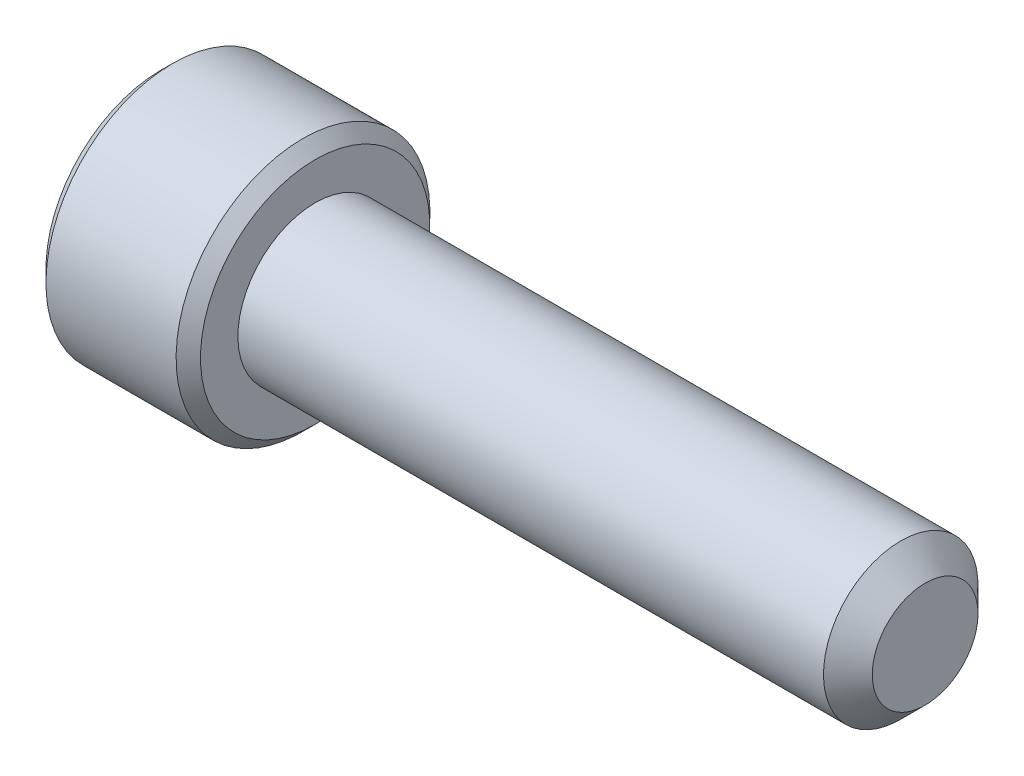
ISO-10303-21;
HEADER;
FILE_DESCRIPTION(('STEP AP214'),'2;1');
FILE_NAME('part.step','',(''),(''),'','','');
FILE_SCHEMA(('AUTOMOTIVE_DESIGN { 1 0 10303 214 1 1 1 1 }'));
ENDSEC;
DATA;
#1=APPLICATION_CONTEXT('core data for automotive mechanical design processes');
#2=APPLICATION_PROTOCOL_DEFINITION('international standard','automotive_design',2000,#1);
#3=PRODUCT_CONTEXT('',#1,'mechanical');
#4=PRODUCT('Part','Part','',(#3));
#5=PRODUCT_RELATED_PRODUCT_CATEGORY('part','',(#4));
#6=PRODUCT_DEFINITION_FORMATION('','',#4);
#7=PRODUCT_DEFINITION_CONTEXT('part definition',#1,'design');
#8=PRODUCT_DEFINITION('design','',#6,#7);
#9=PRODUCT_DEFINITION_SHAPE('','',#8);
#10=(LENGTH_UNIT() NAMED_UNIT(*) SI_UNIT(.MILLI.,.METRE.));
#11=(NAMED_UNIT(*) PLANE_ANGLE_UNIT() SI_UNIT($,.RADIAN.));
#12=(NAMED_UNIT(*) SI_UNIT($,.STERADIAN.) SOLID_ANGLE_UNIT());
#13=UNCERTAINTY_MEASURE_WITH_UNIT(LENGTH_MEASURE(1.E-05),#10,'distance_accuracy_value','');
#14=(GEOMETRIC_REPRESENTATION_CONTEXT(3) GLOBAL_UNCERTAINTY_ASSIGNED_CONTEXT((#13)) GLOBAL_UNIT_ASSIGNED_CONTEXT((#10,
#11,#12)) REPRESENTATION_CONTEXT('',''));
#15=CARTESIAN_POINT('',(0.,0.,0.));
#16=DIRECTION('',(0.,0.,1.));
#17=DIRECTION('',(1.,0.,0.));
#18=AXIS2_PLACEMENT_3D('',#15,#16,#17);
#19=CARTESIAN_POINT('',(-4.826,0.,0.));
#20=DIRECTION('',(-1.,0.,0.));
#21=DIRECTION('',(0.,-1.,0.));
#22=AXIS2_PLACEMENT_3D('',#19,#20,#21);
#23=CONICAL_SURFACE('',#22,2.29135888084633,0.785398163397443);
#24=CARTESIAN_POINT('',(-4.82611547878184,1.14556397036933,1.984575));
#25=CARTESIAN_POINT('',(-4.78676285226391,1.18494849354192,1.9163590048332));
#26=CARTESIAN_POINT('',(-4.74972131044618,1.22499159714897,1.84700231489304));
#27=CARTESIAN_POINT('',(-4.68189885842332,1.30664400291398,1.70557619954782));
#28=CARTESIAN_POINT('',(-4.65115568909175,1.34826107209555,1.63349332126322));
#29=CARTESIAN_POINT('',(-4.59849188881121,1.43217992591557,1.488141602734));
#30=CARTESIAN_POINT('',(-4.57643887587996,1.47446033414662,1.41490978751307));
#31=CARTESIAN_POINT('',(-4.54246149294387,1.55995203534886,1.2668338174053));
#32=CARTESIAN_POINT('',(-4.53051175609172,1.60316071596704,1.19199418724659));
#33=CARTESIAN_POINT('',(-4.5197300990819,1.6776271237807,1.0630145854562));
#34=CARTESIAN_POINT('',(-4.51813389905907,1.70878862377409,1.00904128422757));
#35=CARTESIAN_POINT('',(-4.52082183886529,1.77106070163464,0.901182881480215));
#36=CARTESIAN_POINT('',(-4.52510804034045,1.80217125782055,0.847297817514493));
#37=CARTESIAN_POINT('',(-4.53931687301351,1.86409863044401,0.740036461751415));
#38=CARTESIAN_POINT('',(-4.54924581045226,1.89491507894442,0.686660807239879));
#39=CARTESIAN_POINT('',(-4.57419508427453,1.95601509066826,0.580832482591125));
#40=CARTESIAN_POINT('',(-4.58921503038948,1.98629869455159,0.52837974202892));
#41=CARTESIAN_POINT('',(-4.63380785163566,2.06387267818151,0.39401766103637));
#42=CARTESIAN_POINT('',(-4.66674299593832,2.11068193911104,0.312941642841691));
#43=CARTESIAN_POINT('',(-4.72234244120219,2.17951072233758,0.19372669327017));
#44=CARTESIAN_POINT('',(-4.74187759205186,2.20219286161692,0.154440075614006));
#45=CARTESIAN_POINT('',(-4.7827287381194,2.24713694590237,0.0765946381319512));
#46=CARTESIAN_POINT('',(-4.80404363956835,2.26939913882716,0.0380353888983038));
#47=CARTESIAN_POINT('',(-4.82611547878184,2.29147435090017,-0.000199999999999197));
#48=B_SPLINE_CURVE_WITH_KNOTS('',3,(#24,#25,#26,#27,#28,#29,#30,#31,#32,#33,#34,#35,#36,#37,#38,
#39,#40,#41,#42,#43,#44,#45,#46,#47),.UNSPECIFIED.,.F.,.F.,(4,2,2,2,2,2,2,2,2,2,2,4),(0.,
0.264339630306623,0.530219665093688,0.791876416371451,1.05287424418108,1.23963984393199,
1.4264709174385,1.61351120244032,1.80053715247538,2.09764209964315,2.24579179873713,
2.39385111134157),.UNSPECIFIED.);
#49=CARTESIAN_POINT('',(-4.826,1.14567944042317,1.984375));
#50=VERTEX_POINT('',#49);
#51=CARTESIAN_POINT('',(-4.826,2.29135888084633,0.));
#52=VERTEX_POINT('',#51);
#53=EDGE_CURVE('E91',#50,#52,#48,.T.);
#54=ORIENTED_EDGE('',*,*,#53,.F.);
#55=CARTESIAN_POINT('',(-4.826,0.,0.));
#56=DIRECTION('',(1.,0.,0.));
#57=DIRECTION('',(0.,1.,0.));
#58=AXIS2_PLACEMENT_3D('',#55,#56,#57);
#59=CIRCLE('',#58,2.29135888084633);
#60=EDGE_CURVE('E190',#52,#50,#59,.T.);
#61=ORIENTED_EDGE('',*,*,#60,.F.);
#62=EDGE_LOOP('',(#54,#61));
#63=FACE_BOUND('',#62,.T.);
#64=ADVANCED_FACE('F32',(#63),#23,.F.);
#65=CARTESIAN_POINT('',(-7.34552503164278,-4.38256316312969,1.984375));
#66=CARTESIAN_POINT('',(-7.22855454754807,-4.25412150672958,1.984375));
#67=CARTESIAN_POINT('',(-7.1120218967379,-4.12527465006827,1.984375));
#68=CARTESIAN_POINT('',(-6.88017233530987,-3.86643242495077,1.984375));
#69=CARTESIAN_POINT('',(-6.76485574835251,-3.73643676685388,1.984375));
#70=CARTESIAN_POINT('',(-6.53496761730952,-3.47402997746118,1.984375));
#71=CARTESIAN_POINT('',(-6.42040843251579,-3.34160799076587,1.984375));
#72=CARTESIAN_POINT('',(-6.19354881314577,-3.07486646254648,1.984375));
#73=CARTESIAN_POINT('',(-6.08124807001603,-2.94054718456238,1.984375));
#74=CARTESIAN_POINT('',(-5.87562128395703,-2.68866291476753,1.984375));
#75=CARTESIAN_POINT('',(-5.78187450848826,-2.57144250733694,1.984375));
#76=CARTESIAN_POINT('',(-5.59763661164621,-2.33447351144926,1.984375));
#77=CARTESIAN_POINT('',(-5.50714512492787,-2.21472520910972,1.984375));
#78=CARTESIAN_POINT('',(-5.33096679527763,-1.97197030416461,1.984375));
#79=CARTESIAN_POINT('',(-5.24527361385108,-1.84896833197487,1.984375));
#80=CARTESIAN_POINT('',(-5.08091907299013,-1.5983684417922,1.984375));
#81=CARTESIAN_POINT('',(-5.00225291006126,-1.47077374828022,1.984375));
#82=CARTESIAN_POINT('',(-4.89371881405518,-1.27679924803707,1.984375));
#83=CARTESIAN_POINT('',(-4.85961697469403,-1.21280681023282,1.984375));
#84=CARTESIAN_POINT('',(-4.79470022081286,-1.08318295509689,1.984375));
#85=CARTESIAN_POINT('',(-4.76388592959238,-1.01755122986674,1.984375));
#86=CARTESIAN_POINT('',(-4.67770673157076,-0.818112319573823,1.984375));
#87=CARTESIAN_POINT('',(-4.62841532737901,-0.68143817164542,1.984375));
#88=CARTESIAN_POINT('',(-4.57657464506238,-0.484534849228625,1.984375));
#89=CARTESIAN_POINT('',(-4.56363539685181,-0.426997354657412,1.984375));
#90=CARTESIAN_POINT('',(-4.54244355417043,-0.311075231587787,1.984375));
#91=CARTESIAN_POINT('',(-4.53418863196629,-0.252691038648901,1.984375));
#92=CARTESIAN_POINT('',(-4.52278589268839,-0.13552699683614,1.984375));
#93=CARTESIAN_POINT('',(-4.51962887606188,-0.0767480533087008,1.984375));
#94=CARTESIAN_POINT('',(-4.51856562625872,0.040859379256393,1.984375));
#95=CARTESIAN_POINT('',(-4.52065945666977,0.0996878688854256,1.984375));
#96=CARTESIAN_POINT('',(-4.52997042541556,0.216780947001194,1.984375));
#97=CARTESIAN_POINT('',(-4.53717454062507,0.27504658807381,1.984375));
#98=CARTESIAN_POINT('',(-4.55632471278146,0.390795753314785,1.984375));
#99=CARTESIAN_POINT('',(-4.56827186597105,0.448279093493553,1.984375));
#100=CARTESIAN_POINT('',(-4.59641432696866,0.562343003284734,1.984375));
#101=CARTESIAN_POINT('',(-4.61262065429991,0.618920821282784,1.984375));
#102=CARTESIAN_POINT('',(-4.6486728879034,0.730887391144706,1.984375));
#103=CARTESIAN_POINT('',(-4.6685186047409,0.786276204730186,1.984375));
#104=CARTESIAN_POINT('',(-4.71904823616544,0.915764898686524,1.984375));
#105=CARTESIAN_POINT('',(-4.75104975645409,0.989348684601598,1.984375));
#106=CARTESIAN_POINT('',(-4.8195013348601,1.13443207793684,1.984375));
#107=CARTESIAN_POINT('',(-4.85595375222347,1.20593055492455,1.984375));
#108=CARTESIAN_POINT('',(-4.93238072627356,1.34720036694736,1.984375));
#109=CARTESIAN_POINT('',(-4.97236254348688,1.41696774475327,1.984375));
#110=CARTESIAN_POINT('',(-5.05501798725671,1.55486033218906,1.984375));
#111=CARTESIAN_POINT('',(-5.09769114108908,1.62298582732066,1.984375));
#112=CARTESIAN_POINT('',(-5.22979965333655,1.82673884970796,1.984375));
#113=CARTESIAN_POINT('',(-5.3224862074514,1.96025358861665,1.984375));
#114=CARTESIAN_POINT('',(-5.51320461076306,2.22310529105792,1.984375));
#115=CARTESIAN_POINT('',(-5.61123029191713,2.35244681162555,1.984375));
#116=CARTESIAN_POINT('',(-5.8417818135648,2.64771927567201,1.984375));
#117=CARTESIAN_POINT('',(-5.97561838149977,2.81262293237342,1.984375));
#118=CARTESIAN_POINT('',(-6.24732511473647,3.13917450761943,1.984375));
#119=CARTESIAN_POINT('',(-6.38519718943843,3.30082082182293,1.984375));
#120=CARTESIAN_POINT('',(-6.65925694098781,3.61672188433627,1.984375));
#121=CARTESIAN_POINT('',(-6.79536117949515,3.77104919551812,1.984375));
#122=CARTESIAN_POINT('',(-7.00081696190316,4.00127089894086,1.984375));
#123=CARTESIAN_POINT('',(-7.06949247318902,4.07777111865017,1.984375));
#124=CARTESIAN_POINT('',(-7.20723205118175,4.23041862936248,1.984375));
#125=CARTESIAN_POINT('',(-7.27629611110184,4.30656592648787,1.984375));
#126=CARTESIAN_POINT('',(-7.34552503164278,4.38256316312969,1.984375));
#127=B_SPLINE_CURVE_WITH_KNOTS('',3,(#65,#66,#67,#68,#69,#70,#71,#72,#73,#74,#75,#76,#77,#78,
#79,#80,#81,#82,#83,#84,#85,#86,#87,#88,#89,#90,#91,#92,#93,#94,#95,#96,#97,#98,#99,#100,#101,
#102,#103,#104,#105,#106,#107,#108,#109,#110,#111,#112,#113,#114,#115,#116,#117,#118,#119,#120,
#121,#122,#123,#124,#125,#126),.UNSPECIFIED.,.F.,.F.,(4,2,2,2,2,2,2,2,2,2,2,2,2,2,2,2,2,2,2,2,2,
2,2,2,2,2,2,2,2,2,4),(0.,0.5211724127341,1.04248020388798,1.56775750090225,2.09296253899618,
2.5432150115554,2.993416793061,3.44300910932738,3.89229170529407,4.10973556952338,
4.32722058682471,4.76107034419634,4.93783869037214,5.11451911980139,5.29088035839971,
5.46724373274119,5.64315926728084,5.81911548429021,5.99553150295932,6.17193834156116,
6.41246021585711,6.65311013938415,6.89426719857916,7.13538201669343,7.62272742387335,
8.10952129660061,8.74655188785267,9.38388892417281,10.0011777857046,10.3095881172925,
10.6179930785071),.UNSPECIFIED.);
#128=CARTESIAN_POINT('',(-4.826,-1.14567944042317,1.984375));
#129=VERTEX_POINT('',#128);
#130=EDGE_CURVE('E167',#129,#50,#127,.T.);
#131=ORIENTED_EDGE('',*,*,#130,.F.);
#132=EDGE_CURVE('E193',#50,#129,#59,.T.);
#133=ORIENTED_EDGE('',*,*,#132,.F.);
#134=EDGE_LOOP('',(#131,#133));
#135=FACE_BOUND('',#134,.T.);
#136=ADVANCED_FACE('F209',(#135),#23,.F.);
#137=CARTESIAN_POINT('',(-4.82611547878184,-2.29147435090017,-0.000199999999999607));
#138=CARTESIAN_POINT('',(-4.78676285226391,-2.25208982772758,0.0680159951668021));
#139=CARTESIAN_POINT('',(-4.74972131044618,-2.21204672412052,0.137372685106965));
#140=CARTESIAN_POINT('',(-4.68189885842332,-2.13039431835552,0.278798800452185));
#141=CARTESIAN_POINT('',(-4.65115568909175,-2.08877724917394,0.350881678736779));
#142=CARTESIAN_POINT('',(-4.59849188881121,-2.00485839535392,0.496233397265999));
#143=CARTESIAN_POINT('',(-4.57643887587996,-1.96257798712287,0.569465212486933));
#144=CARTESIAN_POINT('',(-4.54246149294387,-1.87708628592064,0.717541182594699));
#145=CARTESIAN_POINT('',(-4.53051175609172,-1.83387760530245,0.792380812753416));
#146=CARTESIAN_POINT('',(-4.5197300990819,-1.7594111974888,0.921360414543805));
#147=CARTESIAN_POINT('',(-4.51813389905906,-1.7282496974954,0.975333715772431));
#148=CARTESIAN_POINT('',(-4.52082183886529,-1.66597761963485,1.08319211851979));
#149=CARTESIAN_POINT('',(-4.52510804034045,-1.63486706344894,1.13707718248551));
#150=CARTESIAN_POINT('',(-4.53931687301351,-1.57293969082548,1.24433853824859));
#151=CARTESIAN_POINT('',(-4.54924581045226,-1.54212324232508,1.29771419276012));
#152=CARTESIAN_POINT('',(-4.57419508427453,-1.48102323060123,1.40354251740888));
#153=CARTESIAN_POINT('',(-4.58921503038948,-1.45073962671791,1.45599525797108));
#154=CARTESIAN_POINT('',(-4.63380785163566,-1.37316564308798,1.59035733896363));
#155=CARTESIAN_POINT('',(-4.66674299593832,-1.32635638215846,1.67143335715831));
#156=CARTESIAN_POINT('',(-4.72234244120219,-1.25752759893192,1.79064830672983));
#157=CARTESIAN_POINT('',(-4.74187759205186,-1.23484545965258,1.829934924386));
#158=CARTESIAN_POINT('',(-4.7827287381194,-1.18990137536713,1.90778036186805));
#159=CARTESIAN_POINT('',(-4.80404363956835,-1.16763918244233,1.9463396111017));
#160=CARTESIAN_POINT('',(-4.82611547878184,-1.14556397036933,1.984575));
#161=B_SPLINE_CURVE_WITH_KNOTS('',3,(#137,#138,#139,#140,#141,#142,#143,#144,#145,#146,#147,
#148,#149,#150,#151,#152,#153,#154,#155,#156,#157,#158,#159,#160),.UNSPECIFIED.,.F.,.F.,(4,2,2,
2,2,2,2,2,2,2,2,4),(0.,0.264339630306624,0.530219665093689,0.791876416371453,1.05287424418108,
1.23963984393199,1.42647091743851,1.61351120244033,1.80053715247538,2.09764209964315,
2.24579179873713,2.39385111134157),.UNSPECIFIED.);
#162=CARTESIAN_POINT('',(-4.826,-2.29135888084633,0.));
#163=VERTEX_POINT('',#162);
#164=EDGE_CURVE('E259',#163,#129,#161,.T.);
#165=ORIENTED_EDGE('',*,*,#164,.F.);
#166=EDGE_CURVE('E253',#129,#163,#59,.T.);
#167=ORIENTED_EDGE('',*,*,#166,.F.);
#168=EDGE_LOOP('',(#165,#167));
#169=FACE_BOUND('',#168,.T.);
#170=ADVANCED_FACE('F214',(#169),#23,.F.);
#171=CARTESIAN_POINT('',(-4.82611547878184,-1.14556397036933,-1.984575));
#172=CARTESIAN_POINT('',(-4.78676285226391,-1.18494849354192,-1.9163590048332));
#173=CARTESIAN_POINT('',(-4.74972131044618,-1.22499159714897,-1.84700231489304));
#174=CARTESIAN_POINT('',(-4.68189885842332,-1.30664400291398,-1.70557619954782));
#175=CARTESIAN_POINT('',(-4.65115568909175,-1.34826107209555,-1.63349332126322));
#176=CARTESIAN_POINT('',(-4.59849188881121,-1.43217992591557,-1.488141602734));
#177=CARTESIAN_POINT('',(-4.57643887587996,-1.47446033414662,-1.41490978751307));
#178=CARTESIAN_POINT('',(-4.54246149294387,-1.55995203534886,-1.2668338174053));
#179=CARTESIAN_POINT('',(-4.53051175609172,-1.60316071596704,-1.19199418724659));
#180=CARTESIAN_POINT('',(-4.5197300990819,-1.6776271237807,-1.0630145854562));
#181=CARTESIAN_POINT('',(-4.51813389905906,-1.7087886237741,-1.00904128422757));
#182=CARTESIAN_POINT('',(-4.52082183886528,-1.77106070163464,-0.901182881480215));
#183=CARTESIAN_POINT('',(-4.52510804034045,-1.80217125782055,-0.847297817514493));
#184=CARTESIAN_POINT('',(-4.53931687301351,-1.86409863044401,-0.740036461751414));
#185=CARTESIAN_POINT('',(-4.54924581045226,-1.89491507894442,-0.686660807239878));
#186=CARTESIAN_POINT('',(-4.57419508427453,-1.95601509066827,-0.580832482591124));
#187=CARTESIAN_POINT('',(-4.58921503038948,-1.98629869455159,-0.528379742028919));
#188=CARTESIAN_POINT('',(-4.63380785163566,-2.06387267818151,-0.394017661036369));
#189=CARTESIAN_POINT('',(-4.66674299593832,-2.11068193911104,-0.31294164284169));
#190=CARTESIAN_POINT('',(-4.72234244120219,-2.17951072233758,-0.193726693270169));
#191=CARTESIAN_POINT('',(-4.74187759205186,-2.20219286161692,-0.154440075614005));
#192=CARTESIAN_POINT('',(-4.7827287381194,-2.24713694590237,-0.0765946381319501));
#193=CARTESIAN_POINT('',(-4.80404363956835,-2.26939913882716,-0.0380353888983025));
#194=CARTESIAN_POINT('',(-4.82611547878184,-2.29147435090017,0.00020000000000062));
#195=B_SPLINE_CURVE_WITH_KNOTS('',3,(#171,#172,#173,#174,#175,#176,#177,#178,#179,#180,#181,
#182,#183,#184,#185,#186,#187,#188,#189,#190,#191,#192,#193,#194),.UNSPECIFIED.,.F.,.F.,(4,2,2,
2,2,2,2,2,2,2,2,4),(0.,0.264339630306624,0.530219665093689,0.791876416371453,1.05287424418108,
1.23963984393199,1.42647091743851,1.61351120244033,1.80053715247538,2.09764209964315,
2.24579179873713,2.39385111134158),.UNSPECIFIED.);
#196=CARTESIAN_POINT('',(-4.826,-1.14567944042317,-1.984375));
#197=VERTEX_POINT('',#196);
#198=EDGE_CURVE('E246',#197,#163,#195,.T.);
#199=ORIENTED_EDGE('',*,*,#198,.F.);
#200=EDGE_CURVE('E252',#163,#197,#59,.T.);
#201=ORIENTED_EDGE('',*,*,#200,.F.);
#202=EDGE_LOOP('',(#199,#201));
#203=FACE_BOUND('',#202,.T.);
#204=ADVANCED_FACE('F233',(#203),#23,.F.);
#205=CARTESIAN_POINT('',(-7.34552503164278,4.38256316312969,-1.984375));
#206=CARTESIAN_POINT('',(-7.22855454754806,4.25412150672957,-1.984375));
#207=CARTESIAN_POINT('',(-7.11202189673789,4.12527465006826,-1.984375));
#208=CARTESIAN_POINT('',(-6.88017233530987,3.86643242495076,-1.984375));
#209=CARTESIAN_POINT('',(-6.76485574835251,3.73643676685388,-1.984375));
#210=CARTESIAN_POINT('',(-6.53496761730952,3.47402997746118,-1.984375));
#211=CARTESIAN_POINT('',(-6.42040843251579,3.34160799076586,-1.984375));
#212=CARTESIAN_POINT('',(-6.19354881314577,3.07486646254648,-1.984375));
#213=CARTESIAN_POINT('',(-6.08124807001603,2.94054718456238,-1.984375));
#214=CARTESIAN_POINT('',(-5.87562128395703,2.68866291476753,-1.984375));
#215=CARTESIAN_POINT('',(-5.78187450848826,2.57144250733694,-1.984375));
#216=CARTESIAN_POINT('',(-5.59763661164622,2.33447351144926,-1.984375));
#217=CARTESIAN_POINT('',(-5.50714512492787,2.21472520910972,-1.984375));
#218=CARTESIAN_POINT('',(-5.33096679527763,1.97197030416461,-1.984375));
#219=CARTESIAN_POINT('',(-5.24527361385108,1.84896833197487,-1.984375));
#220=CARTESIAN_POINT('',(-5.08091907299013,1.5983684417922,-1.984375));
#221=CARTESIAN_POINT('',(-5.00225291006126,1.47077374828022,-1.984375));
#222=CARTESIAN_POINT('',(-4.89371881405518,1.27679924803707,-1.984375));
#223=CARTESIAN_POINT('',(-4.85961697469403,1.21280681023282,-1.984375));
#224=CARTESIAN_POINT('',(-4.79470022081287,1.08318295509689,-1.984375));
#225=CARTESIAN_POINT('',(-4.76388592959239,1.01755122986674,-1.984375));
#226=CARTESIAN_POINT('',(-4.67770673157076,0.818112319573823,-1.984375));
#227=CARTESIAN_POINT('',(-4.62841532737901,0.68143817164542,-1.984375));
#228=CARTESIAN_POINT('',(-4.57657464506239,0.484534849228624,-1.984375));
#229=CARTESIAN_POINT('',(-4.56363539685182,0.426997354657412,-1.984375));
#230=CARTESIAN_POINT('',(-4.54244355417043,0.311075231587786,-1.984375));
#231=CARTESIAN_POINT('',(-4.53418863196629,0.252691038648901,-1.984375));
#232=CARTESIAN_POINT('',(-4.52278589268839,0.135526996836139,-1.984375));
#233=CARTESIAN_POINT('',(-4.51962887606188,0.0767480533086995,-1.984375));
#234=CARTESIAN_POINT('',(-4.51856562625872,-0.0408593792563943,-1.984375));
#235=CARTESIAN_POINT('',(-4.52065945666977,-0.0996878688854267,-1.984375));
#236=CARTESIAN_POINT('',(-4.52997042541556,-0.216780947001195,-1.984375));
#237=CARTESIAN_POINT('',(-4.53717454062507,-0.275046588073811,-1.984375));
#238=CARTESIAN_POINT('',(-4.55632471278146,-0.390795753314786,-1.984375));
#239=CARTESIAN_POINT('',(-4.56827186597105,-0.448279093493554,-1.984375));
#240=CARTESIAN_POINT('',(-4.59641432696866,-0.562343003284735,-1.984375));
#241=CARTESIAN_POINT('',(-4.61262065429991,-0.618920821282785,-1.984375));
#242=CARTESIAN_POINT('',(-4.6486728879034,-0.730887391144708,-1.984375));
#243=CARTESIAN_POINT('',(-4.6685186047409,-0.786276204730187,-1.984375));
#244=CARTESIAN_POINT('',(-4.71904823616544,-0.915764898686525,-1.984375));
#245=CARTESIAN_POINT('',(-4.75104975645409,-0.9893486846016,-1.984375));
#246=CARTESIAN_POINT('',(-4.8195013348601,-1.13443207793684,-1.984375));
#247=CARTESIAN_POINT('',(-4.85595375222347,-1.20593055492455,-1.984375));
#248=CARTESIAN_POINT('',(-4.93238072627356,-1.34720036694737,-1.984375));
#249=CARTESIAN_POINT('',(-4.97236254348688,-1.41696774475327,-1.984375));
#250=CARTESIAN_POINT('',(-5.05501798725671,-1.55486033218906,-1.984375));
#251=CARTESIAN_POINT('',(-5.09769114108908,-1.62298582732067,-1.984375));
#252=CARTESIAN_POINT('',(-5.22979965333655,-1.82673884970796,-1.984375));
#253=CARTESIAN_POINT('',(-5.3224862074514,-1.96025358861666,-1.984375));
#254=CARTESIAN_POINT('',(-5.51320461076306,-2.22310529105793,-1.984375));
#255=CARTESIAN_POINT('',(-5.61123029191713,-2.35244681162555,-1.984375));
#256=CARTESIAN_POINT('',(-5.8417818135648,-2.64771927567202,-1.984375));
#257=CARTESIAN_POINT('',(-5.97561838149977,-2.81262293237343,-1.984375));
#258=CARTESIAN_POINT('',(-6.24732511473647,-3.13917450761944,-1.984375));
#259=CARTESIAN_POINT('',(-6.38519718943843,-3.30082082182293,-1.984375));
#260=CARTESIAN_POINT('',(-6.65925694098781,-3.61672188433627,-1.984375));
#261=CARTESIAN_POINT('',(-6.79536117949515,-3.77104919551812,-1.984375));
#262=CARTESIAN_POINT('',(-7.00081696190315,-4.00127089894086,-1.984375));
#263=CARTESIAN_POINT('',(-7.06949247318902,-4.07777111865017,-1.984375));
#264=CARTESIAN_POINT('',(-7.20723205118175,-4.23041862936248,-1.984375));
#265=CARTESIAN_POINT('',(-7.27629611110184,-4.30656592648786,-1.984375));
#266=CARTESIAN_POINT('',(-7.34552503164278,-4.38256316312969,-1.984375));
#267=B_SPLINE_CURVE_WITH_KNOTS('',3,(#205,#206,#207,#208,#209,#210,#211,#212,#213,#214,#215,
#216,#217,#218,#219,#220,#221,#222,#223,#224,#225,#226,#227,#228,#229,#230,#231,#232,#233,#234,
#235,#236,#237,#238,#239,#240,#241,#242,#243,#244,#245,#246,#247,#248,#249,#250,#251,#252,#253,
#254,#255,#256,#257,#258,#259,#260,#261,#262,#263,#264,#265,#266),.UNSPECIFIED.,.F.,.F.,(4,2,2,
2,2,2,2,2,2,2,2,2,2,2,2,2,2,2,2,2,2,2,2,2,2,2,2,2,2,2,4),(0.,0.5211724127341,1.04248020388798,
1.56775750090225,2.09296253899618,2.5432150115554,2.99341679306099,3.44300910932738,
3.89229170529407,4.10973556952338,4.32722058682471,4.76107034419633,4.93783869037214,
5.11451911980138,5.2908803583997,5.46724373274119,5.64315926728084,5.8191154842902,
5.99553150295931,6.17193834156116,6.4124602158571,6.65311013938415,6.89426719857916,
7.13538201669343,7.62272742387335,8.10952129660061,8.74655188785267,9.3838889241728,
10.0011777857046,10.3095881172925,10.6179930785071),.UNSPECIFIED.);
#268=CARTESIAN_POINT('',(-4.826,1.14567944042317,-1.984375));
#269=VERTEX_POINT('',#268);
#270=EDGE_CURVE('E137',#269,#197,#267,.T.);
#271=ORIENTED_EDGE('',*,*,#270,.F.);
#272=EDGE_CURVE('E243',#197,#269,#59,.T.);
#273=ORIENTED_EDGE('',*,*,#272,.F.);
#274=EDGE_LOOP('',(#271,#273));
#275=FACE_BOUND('',#274,.T.);
#276=ADVANCED_FACE('F206',(#275),#23,.F.);
#277=CARTESIAN_POINT('',(-2.53464111915364,0.,0.));
#278=DIRECTION('',(1.,0.,0.));
#279=DIRECTION('',(0.,1.,0.));
#280=AXIS2_PLACEMENT_3D('',#277,#278,#279);
#281=CYLINDRICAL_SURFACE('',#280,2.413);
#282=CARTESIAN_POINT('',(0.,0.,0.));
#283=DIRECTION('',(1.,0.,0.));
#284=DIRECTION('',(0.,1.,0.));
#285=AXIS2_PLACEMENT_3D('',#282,#283,#284);
#286=CIRCLE('',#285,2.413);
#287=CARTESIAN_POINT('',(0.,2.413,0.));
#288=VERTEX_POINT('',#287);
#289=EDGE_CURVE('E174',#288,#288,#286,.T.);
#290=ORIENTED_EDGE('',*,*,#289,.T.);
#291=EDGE_LOOP('',(#290));
#292=FACE_BOUND('',#291,.T.);
#293=CARTESIAN_POINT('',(18.288,0.,0.));
#294=DIRECTION('',(1.,0.,0.));
#295=DIRECTION('',(0.,1.,0.));
#296=AXIS2_PLACEMENT_3D('',#293,#294,#295);
#297=CIRCLE('',#296,2.413);
#298=CARTESIAN_POINT('',(18.288,2.413,0.));
#299=VERTEX_POINT('',#298);
#300=EDGE_CURVE('E11',#299,#299,#297,.T.);
#301=ORIENTED_EDGE('',*,*,#300,.F.);
#302=EDGE_LOOP('',(#301));
#303=FACE_BOUND('',#302,.T.);
#304=ADVANCED_FACE('F34',(#292,#303),#281,.T.);
#305=CARTESIAN_POINT('',(19.05,0.,0.));
#306=DIRECTION('',(-1.,0.,0.));
#307=DIRECTION('',(0.,-1.,0.));
#308=AXIS2_PLACEMENT_3D('',#305,#306,#307);
#309=CONICAL_SURFACE('',#308,1.651,0.78539816339745);
#310=ORIENTED_EDGE('',*,*,#300,.T.);
#311=EDGE_LOOP('',(#310));
#312=FACE_BOUND('',#311,.T.);
#313=CARTESIAN_POINT('',(19.05,0.,0.));
#314=DIRECTION('',(1.,0.,0.));
#315=DIRECTION('',(0.,1.,0.));
#316=AXIS2_PLACEMENT_3D('',#313,#314,#315);
#317=CIRCLE('',#316,1.651);
#318=CARTESIAN_POINT('',(19.05,1.651,0.));
#319=VERTEX_POINT('',#318);
#320=EDGE_CURVE('E41',#319,#319,#317,.T.);
#321=ORIENTED_EDGE('',*,*,#320,.F.);
#322=EDGE_LOOP('',(#321));
#323=FACE_BOUND('',#322,.T.);
#324=ADVANCED_FACE('F199',(#312,#323),#309,.T.);
#325=CARTESIAN_POINT('',(19.05,0.,0.));
#326=DIRECTION('',(1.,0.,0.));
#327=DIRECTION('',(0.,1.,0.));
#328=AXIS2_PLACEMENT_3D('',#325,#326,#327);
#329=PLANE('',#328);
#330=ORIENTED_EDGE('',*,*,#320,.T.);
#331=EDGE_LOOP('',(#330));
#332=FACE_BOUND('',#331,.T.);
#333=ADVANCED_FACE('F197',(#332),#329,.T.);
#334=CARTESIAN_POINT('',(-4.82611547878184,2.29147435090017,0.000200000000000617));
#335=CARTESIAN_POINT('',(-4.78676285226391,2.25208982772758,-0.0680159951668013));
#336=CARTESIAN_POINT('',(-4.74972131044618,2.21204672412052,-0.137372685106964));
#337=CARTESIAN_POINT('',(-4.68189885842332,2.13039431835552,-0.278798800452184));
#338=CARTESIAN_POINT('',(-4.65115568909175,2.08877724917394,-0.350881678736778));
#339=CARTESIAN_POINT('',(-4.59849188881121,2.00485839535392,-0.496233397265997));
#340=CARTESIAN_POINT('',(-4.57643887587996,1.96257798712287,-0.569465212486931));
#341=CARTESIAN_POINT('',(-4.54246149294387,1.87708628592064,-0.717541182594697));
#342=CARTESIAN_POINT('',(-4.53051175609172,1.83387760530245,-0.792380812753414));
#343=CARTESIAN_POINT('',(-4.5197300990819,1.7594111974888,-0.921360414543804));
#344=CARTESIAN_POINT('',(-4.51813389905907,1.7282496974954,-0.975333715772429));
#345=CARTESIAN_POINT('',(-4.52082183886529,1.66597761963485,-1.08319211851979));
#346=CARTESIAN_POINT('',(-4.52510804034045,1.63486706344894,-1.13707718248551));
#347=CARTESIAN_POINT('',(-4.53931687301351,1.57293969082548,-1.24433853824859));
#348=CARTESIAN_POINT('',(-4.54924581045226,1.54212324232508,-1.29771419276012));
#349=CARTESIAN_POINT('',(-4.57419508427453,1.48102323060123,-1.40354251740888));
#350=CARTESIAN_POINT('',(-4.58921503038948,1.45073962671791,-1.45599525797108));
#351=CARTESIAN_POINT('',(-4.63380785163566,1.37316564308798,-1.59035733896363));
#352=CARTESIAN_POINT('',(-4.66674299593832,1.32635638215846,-1.67143335715831));
#353=CARTESIAN_POINT('',(-4.72234244120219,1.25752759893191,-1.79064830672983));
#354=CARTESIAN_POINT('',(-4.74187759205186,1.23484545965258,-1.829934924386));
#355=CARTESIAN_POINT('',(-4.7827287381194,1.18990137536713,-1.90778036186805));
#356=CARTESIAN_POINT('',(-4.80404363956835,1.16763918244233,-1.9463396111017));
#357=CARTESIAN_POINT('',(-4.82611547878184,1.14556397036933,-1.984575));
#358=B_SPLINE_CURVE_WITH_KNOTS('',3,(#334,#335,#336,#337,#338,#339,#340,#341,#342,#343,#344,
#345,#346,#347,#348,#349,#350,#351,#352,#353,#354,#355,#356,#357),.UNSPECIFIED.,.F.,.F.,(4,2,2,
2,2,2,2,2,2,2,2,4),(0.,0.264339630306624,0.530219665093689,0.791876416371452,1.05287424418108,
1.23963984393199,1.4264709174385,1.61351120244033,1.80053715247538,2.09764209964315,
2.24579179873713,2.39385111134158),.UNSPECIFIED.);
#359=EDGE_CURVE('E119',#52,#269,#358,.T.);
#360=ORIENTED_EDGE('',*,*,#359,.F.);
#361=EDGE_CURVE('E189',#269,#52,#59,.T.);
#362=ORIENTED_EDGE('',*,*,#361,.F.);
#363=EDGE_LOOP('',(#360,#362));
#364=FACE_BOUND('',#363,.T.);
#365=ADVANCED_FACE('F144',(#364),#23,.F.);
#366=CARTESIAN_POINT('',(-4.826,3.5814,0.));
#367=DIRECTION('',(-1.,0.,0.));
#368=DIRECTION('',(0.,-1.,0.));
#369=AXIS2_PLACEMENT_3D('',#366,#367,#368);
#370=PLANE('',#369);
#371=ORIENTED_EDGE('',*,*,#60,.T.);
#372=ORIENTED_EDGE('',*,*,#132,.T.);
#373=ORIENTED_EDGE('',*,*,#166,.T.);
#374=ORIENTED_EDGE('',*,*,#200,.T.);
#375=ORIENTED_EDGE('',*,*,#272,.T.);
#376=ORIENTED_EDGE('',*,*,#361,.T.);
#377=EDGE_LOOP('',(#371,#372,#373,#374,#375,#376));
#378=FACE_BOUND('',#377,.T.);
#379=CARTESIAN_POINT('',(-4.826,0.,0.));
#380=DIRECTION('',(1.,0.,0.));
#381=DIRECTION('',(0.,1.,0.));
#382=AXIS2_PLACEMENT_3D('',#379,#380,#381);
#383=CIRCLE('',#382,3.5814);
#384=CARTESIAN_POINT('',(-4.826,3.5814,0.));
#385=VERTEX_POINT('',#384);
#386=EDGE_CURVE('E186',#385,#385,#383,.T.);
#387=ORIENTED_EDGE('',*,*,#386,.F.);
#388=EDGE_LOOP('',(#387));
#389=FACE_BOUND('',#388,.T.);
#390=ADVANCED_FACE('F217',(#378,#389),#370,.T.);
#391=CARTESIAN_POINT('',(-4.445,0.,0.));
#392=DIRECTION('',(1.,0.,0.));
#393=DIRECTION('',(0.,1.,0.));
#394=AXIS2_PLACEMENT_3D('',#391,#392,#393);
#395=CONICAL_SURFACE('',#394,3.9624,0.785398163397447);
#396=ORIENTED_EDGE('',*,*,#386,.T.);
#397=EDGE_LOOP('',(#396));
#398=FACE_BOUND('',#397,.T.);
#399=CARTESIAN_POINT('',(-4.445,0.,0.));
#400=DIRECTION('',(1.,0.,0.));
#401=DIRECTION('',(0.,1.,0.));
#402=AXIS2_PLACEMENT_3D('',#399,#400,#401);
#403=CIRCLE('',#402,3.9624);
#404=CARTESIAN_POINT('',(-4.445,3.9624,0.));
#405=VERTEX_POINT('',#404);
#406=EDGE_CURVE('E183',#405,#405,#403,.T.);
#407=ORIENTED_EDGE('',*,*,#406,.F.);
#408=EDGE_LOOP('',(#407));
#409=FACE_BOUND('',#408,.T.);
#410=ADVANCED_FACE('F223',(#398,#409),#395,.T.);
#411=CARTESIAN_POINT('',(-2.53464111915364,0.,0.));
#412=DIRECTION('',(1.,0.,0.));
#413=DIRECTION('',(0.,1.,0.));
#414=AXIS2_PLACEMENT_3D('',#411,#412,#413);
#415=CYLINDRICAL_SURFACE('',#414,3.9624);
#416=ORIENTED_EDGE('',*,*,#406,.T.);
#417=EDGE_LOOP('',(#416));
#418=FACE_BOUND('',#417,.T.);
#419=CARTESIAN_POINT('',(-0.380999999999999,0.,0.));
#420=DIRECTION('',(1.,0.,0.));
#421=DIRECTION('',(0.,1.,0.));
#422=AXIS2_PLACEMENT_3D('',#419,#420,#421);
#423=CIRCLE('',#422,3.9624);
#424=CARTESIAN_POINT('',(-0.381,3.9624,0.));
#425=VERTEX_POINT('',#424);
#426=EDGE_CURVE('E180',#425,#425,#423,.T.);
#427=ORIENTED_EDGE('',*,*,#426,.F.);
#428=EDGE_LOOP('',(#427));
#429=FACE_BOUND('',#428,.T.);
#430=ADVANCED_FACE('F390',(#418,#429),#415,.T.);
#431=CARTESIAN_POINT('',(0.,0.,0.));
#432=DIRECTION('',(-1.,0.,0.));
#433=DIRECTION('',(0.,-1.,0.));
#434=AXIS2_PLACEMENT_3D('',#431,#432,#433);
#435=CONICAL_SURFACE('',#434,3.5814,0.78539816339745);
#436=ORIENTED_EDGE('',*,*,#426,.T.);
#437=EDGE_LOOP('',(#436));
#438=FACE_BOUND('',#437,.T.);
#439=CARTESIAN_POINT('',(0.,0.,0.));
#440=DIRECTION('',(1.,0.,0.));
#441=DIRECTION('',(0.,1.,0.));
#442=AXIS2_PLACEMENT_3D('',#439,#440,#441);
#443=CIRCLE('',#442,3.5814);
#444=CARTESIAN_POINT('',(0.,3.5814,0.));
#445=VERTEX_POINT('',#444);
#446=EDGE_CURVE('E177',#445,#445,#443,.T.);
#447=ORIENTED_EDGE('',*,*,#446,.F.);
#448=EDGE_LOOP('',(#447));
#449=FACE_BOUND('',#448,.T.);
#450=ADVANCED_FACE('F400',(#438,#449),#435,.T.);
#451=CARTESIAN_POINT('',(0.,2.413,0.));
#452=DIRECTION('',(1.,0.,0.));
#453=DIRECTION('',(0.,1.,0.));
#454=AXIS2_PLACEMENT_3D('',#451,#452,#453);
#455=PLANE('',#454);
#456=ORIENTED_EDGE('',*,*,#446,.T.);
#457=EDGE_LOOP('',(#456));
#458=FACE_BOUND('',#457,.T.);
#459=ORIENTED_EDGE('',*,*,#289,.F.);
#460=EDGE_LOOP('',(#459));
#461=FACE_BOUND('',#460,.T.);
#462=ADVANCED_FACE('F158',(#458,#461),#455,.T.);
#463=CARTESIAN_POINT('',(-2.54,1.14567944042317,1.984375));
#464=DIRECTION('',(0.,0.866025403784439,0.5));
#465=DIRECTION('',(0.,-0.5,0.866025403784439));
#466=AXIS2_PLACEMENT_3D('',#463,#464,#465);
#467=PLANE('',#466);
#468=ORIENTED_EDGE('',*,*,#53,.T.);
#469=DIRECTION('',(-1.,0.,0.));
#470=VECTOR('',#469,1.);
#471=CARTESIAN_POINT('',(-2.54,2.29135888084633,0.));
#472=LINE('',#471,#470);
#473=CARTESIAN_POINT('',(-2.54,2.29135888084633,0.));
#474=VERTEX_POINT('',#473);
#475=EDGE_CURVE('E48',#474,#52,#472,.T.);
#476=ORIENTED_EDGE('',*,*,#475,.F.);
#477=DIRECTION('',(0.,0.5,-0.866025403784439));
#478=VECTOR('',#477,1.);
#479=CARTESIAN_POINT('',(-2.54,1.14567944042317,1.984375));
#480=LINE('',#479,#478);
#481=CARTESIAN_POINT('',(-2.54,1.14567944042317,1.984375));
#482=VERTEX_POINT('',#481);
#483=EDGE_CURVE('E88',#482,#474,#480,.T.);
#484=ORIENTED_EDGE('',*,*,#483,.F.);
#485=DIRECTION('',(-1.,0.,0.));
#486=VECTOR('',#485,1.);
#487=CARTESIAN_POINT('',(-2.54,1.14567944042317,1.984375));
#488=LINE('',#487,#486);
#489=EDGE_CURVE('E117',#482,#50,#488,.T.);
#490=ORIENTED_EDGE('',*,*,#489,.T.);
#491=EDGE_LOOP('',(#468,#476,#484,#490));
#492=FACE_BOUND('',#491,.T.);
#493=ADVANCED_FACE('F85',(#492),#467,.F.);
#494=CARTESIAN_POINT('',(-2.54,-1.14567944042317,1.984375));
#495=DIRECTION('',(0.,0.,1.));
#496=DIRECTION('',(0.,-1.,0.));
#497=AXIS2_PLACEMENT_3D('',#494,#495,#496);
#498=PLANE('',#497);
#499=ORIENTED_EDGE('',*,*,#130,.T.);
#500=ORIENTED_EDGE('',*,*,#489,.F.);
#501=DIRECTION('',(0.,1.,0.));
#502=VECTOR('',#501,1.);
#503=CARTESIAN_POINT('',(-2.54,-1.14567944042317,1.984375));
#504=LINE('',#503,#502);
#505=CARTESIAN_POINT('',(-2.54,-1.14567944042317,1.984375));
#506=VERTEX_POINT('',#505);
#507=EDGE_CURVE('E94',#506,#482,#504,.T.);
#508=ORIENTED_EDGE('',*,*,#507,.F.);
#509=DIRECTION('',(-1.,0.,0.));
#510=VECTOR('',#509,1.);
#511=CARTESIAN_POINT('',(-2.54,-1.14567944042317,1.984375));
#512=LINE('',#511,#510);
#513=EDGE_CURVE('E120',#506,#129,#512,.T.);
#514=ORIENTED_EDGE('',*,*,#513,.T.);
#515=EDGE_LOOP('',(#499,#500,#508,#514));
#516=FACE_BOUND('',#515,.T.);
#517=ADVANCED_FACE('F157',(#516),#498,.F.);
#518=CARTESIAN_POINT('',(-2.54,-2.29135888084633,0.));
#519=DIRECTION('',(0.,-0.866025403784439,0.499999999999999));
#520=DIRECTION('',(0.,-0.5,-0.866025403784439));
#521=AXIS2_PLACEMENT_3D('',#518,#519,#520);
#522=PLANE('',#521);
#523=ORIENTED_EDGE('',*,*,#164,.T.);
#524=ORIENTED_EDGE('',*,*,#513,.F.);
#525=DIRECTION('',(0.,0.499999999999999,0.866025403784439));
#526=VECTOR('',#525,1.);
#527=CARTESIAN_POINT('',(-2.54,-2.29135888084633,0.));
#528=LINE('',#527,#526);
#529=CARTESIAN_POINT('',(-2.54,-2.29135888084633,0.));
#530=VERTEX_POINT('',#529);
#531=EDGE_CURVE('E114',#530,#506,#528,.T.);
#532=ORIENTED_EDGE('',*,*,#531,.F.);
#533=DIRECTION('',(-1.,0.,0.));
#534=VECTOR('',#533,1.);
#535=CARTESIAN_POINT('',(-2.54,-2.29135888084633,0.));
#536=LINE('',#535,#534);
#537=EDGE_CURVE('E123',#530,#163,#536,.T.);
#538=ORIENTED_EDGE('',*,*,#537,.T.);
#539=EDGE_LOOP('',(#523,#524,#532,#538));
#540=FACE_BOUND('',#539,.T.);
#541=ADVANCED_FACE('F277',(#540),#522,.F.);
#542=CARTESIAN_POINT('',(-2.54,-1.14567944042316,-1.984375));
#543=DIRECTION('',(0.,-0.866025403784439,-0.5));
#544=DIRECTION('',(0.,0.5,-0.866025403784439));
#545=AXIS2_PLACEMENT_3D('',#542,#543,#544);
#546=PLANE('',#545);
#547=ORIENTED_EDGE('',*,*,#198,.T.);
#548=ORIENTED_EDGE('',*,*,#537,.F.);
#549=DIRECTION('',(0.,-0.5,0.866025403784439));
#550=VECTOR('',#549,1.);
#551=CARTESIAN_POINT('',(-2.54,-1.14567944042316,-1.984375));
#552=LINE('',#551,#550);
#553=CARTESIAN_POINT('',(-2.54,-1.14567944042316,-1.984375));
#554=VERTEX_POINT('',#553);
#555=EDGE_CURVE('E111',#554,#530,#552,.T.);
#556=ORIENTED_EDGE('',*,*,#555,.F.);
#557=DIRECTION('',(-1.,0.,0.));
#558=VECTOR('',#557,1.);
#559=CARTESIAN_POINT('',(-2.54,-1.14567944042316,-1.984375));
#560=LINE('',#559,#558);
#561=EDGE_CURVE('E126',#554,#197,#560,.T.);
#562=ORIENTED_EDGE('',*,*,#561,.T.);
#563=EDGE_LOOP('',(#547,#548,#556,#562));
#564=FACE_BOUND('',#563,.T.);
#565=ADVANCED_FACE('F274',(#564),#546,.F.);
#566=CARTESIAN_POINT('',(-2.54,1.14567944042317,-1.984375));
#567=DIRECTION('',(0.,0.,-1.));
#568=DIRECTION('',(-1.,0.,0.));
#569=AXIS2_PLACEMENT_3D('',#566,#567,#568);
#570=PLANE('',#569);
#571=ORIENTED_EDGE('',*,*,#270,.T.);
#572=ORIENTED_EDGE('',*,*,#561,.F.);
#573=DIRECTION('',(0.,-1.,0.));
#574=VECTOR('',#573,1.);
#575=CARTESIAN_POINT('',(-2.54,1.14567944042317,-1.984375));
#576=LINE('',#575,#574);
#577=CARTESIAN_POINT('',(-2.54,1.14567944042317,-1.984375));
#578=VERTEX_POINT('',#577);
#579=EDGE_CURVE('E103',#578,#554,#576,.T.);
#580=ORIENTED_EDGE('',*,*,#579,.F.);
#581=DIRECTION('',(-1.,0.,0.));
#582=VECTOR('',#581,1.);
#583=CARTESIAN_POINT('',(-2.54,1.14567944042317,-1.984375));
#584=LINE('',#583,#582);
#585=EDGE_CURVE('E93',#578,#269,#584,.T.);
#586=ORIENTED_EDGE('',*,*,#585,.T.);
#587=EDGE_LOOP('',(#571,#572,#580,#586));
#588=FACE_BOUND('',#587,.T.);
#589=ADVANCED_FACE('F151',(#588),#570,.F.);
#590=CARTESIAN_POINT('',(-2.54,2.29135888084633,0.));
#591=DIRECTION('',(0.,0.866025403784439,-0.5));
#592=DIRECTION('',(0.,0.5,0.866025403784439));
#593=AXIS2_PLACEMENT_3D('',#590,#591,#592);
#594=PLANE('',#593);
#595=ORIENTED_EDGE('',*,*,#359,.T.);
#596=ORIENTED_EDGE('',*,*,#585,.F.);
#597=DIRECTION('',(0.,-0.5,-0.866025403784439));
#598=VECTOR('',#597,1.);
#599=CARTESIAN_POINT('',(-2.54,2.29135888084633,0.));
#600=LINE('',#599,#598);
#601=EDGE_CURVE('E97',#474,#578,#600,.T.);
#602=ORIENTED_EDGE('',*,*,#601,.F.);
#603=ORIENTED_EDGE('',*,*,#475,.T.);
#604=EDGE_LOOP('',(#595,#596,#602,#603));
#605=FACE_BOUND('',#604,.T.);
#606=ADVANCED_FACE('F98',(#605),#594,.F.);
#607=CARTESIAN_POINT('',(-2.54,0.,0.));
#608=DIRECTION('',(-1.,0.,0.));
#609=DIRECTION('',(0.,0.,1.));
#610=AXIS2_PLACEMENT_3D('',#607,#608,#609);
#611=PLANE('',#610);
#612=CARTESIAN_POINT('',(-2.54,0.,0.));
#613=DIRECTION('',(-1.,0.,0.));
#614=DIRECTION('',(0.,0.,1.));
#615=AXIS2_PLACEMENT_3D('',#612,#613,#614);
#616=CIRCLE('',#615,0.00535888084635376);
#617=CARTESIAN_POINT('',(-2.54,0.,0.00535888084635337));
#618=VERTEX_POINT('',#617);
#619=EDGE_CURVE('E36',#618,#618,#616,.T.);
#620=ORIENTED_EDGE('',*,*,#619,.F.);
#621=EDGE_LOOP('',(#620));
#622=FACE_BOUND('',#621,.T.);
#623=ORIENTED_EDGE('',*,*,#483,.T.);
#624=ORIENTED_EDGE('',*,*,#601,.T.);
#625=ORIENTED_EDGE('',*,*,#579,.T.);
#626=ORIENTED_EDGE('',*,*,#555,.T.);
#627=ORIENTED_EDGE('',*,*,#531,.T.);
#628=ORIENTED_EDGE('',*,*,#507,.T.);
#629=EDGE_LOOP('',(#623,#624,#625,#626,#627,#628));
#630=FACE_BOUND('',#629,.T.);
#631=ADVANCED_FACE('F105',(#622,#630),#611,.T.);
#632=CARTESIAN_POINT('',(-2.53464111915364,0.,0.));
#633=VERTEX_POINT('',#632);
#634=VERTEX_LOOP('',#633);
#635=FACE_BOUND('',#634,.T.);
#636=ORIENTED_EDGE('',*,*,#619,.T.);
#637=EDGE_LOOP('',(#636));
#638=FACE_BOUND('',#637,.T.);
#639=ADVANCED_FACE('F219',(#635,#638),#23,.F.);
#640=CLOSED_SHELL('',(#64,#136,#170,#204,#276,#304,#324,#333,#365,#390,#410,#430,#450,#462,#493,
#517,#541,#565,#589,#606,#631,#639));
#641=MANIFOLD_SOLID_BREP('B2',#640);
#642=ADVANCED_BREP_SHAPE_REPRESENTATION('',(#18,#641),#14);
#643=SHAPE_DEFINITION_REPRESENTATION(#9,#642);
ENDSEC;
END-ISO-10303-21;
